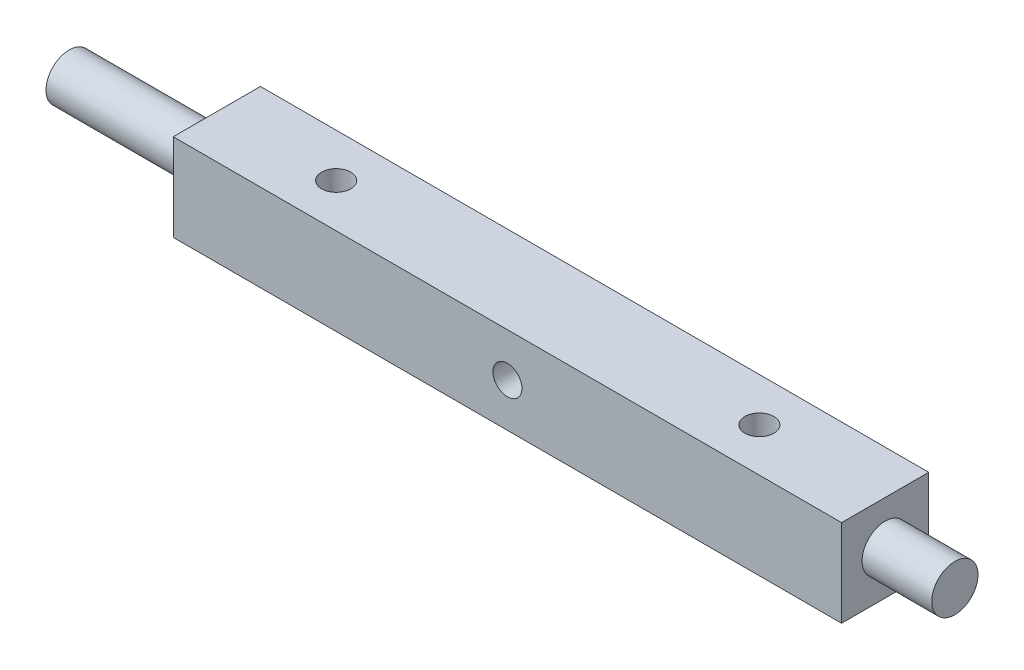
ISO-10303-21;
HEADER;
FILE_DESCRIPTION(('STEP AP214'),'2;1');
FILE_NAME('part.step','',(''),(''),'','','');
FILE_SCHEMA(('AUTOMOTIVE_DESIGN { 1 0 10303 214 1 1 1 1 }'));
ENDSEC;
DATA;
#1=APPLICATION_CONTEXT('core data for automotive mechanical design processes');
#2=APPLICATION_PROTOCOL_DEFINITION('international standard','automotive_design',2000,#1);
#3=PRODUCT_CONTEXT('',#1,'mechanical');
#4=PRODUCT('Part','Part','',(#3));
#5=PRODUCT_RELATED_PRODUCT_CATEGORY('part','',(#4));
#6=PRODUCT_DEFINITION_FORMATION('','',#4);
#7=PRODUCT_DEFINITION_CONTEXT('part definition',#1,'design');
#8=PRODUCT_DEFINITION('design','',#6,#7);
#9=PRODUCT_DEFINITION_SHAPE('','',#8);
#10=(LENGTH_UNIT() NAMED_UNIT(*) SI_UNIT(.MILLI.,.METRE.));
#11=(NAMED_UNIT(*) PLANE_ANGLE_UNIT() SI_UNIT($,.RADIAN.));
#12=(NAMED_UNIT(*) SI_UNIT($,.STERADIAN.) SOLID_ANGLE_UNIT());
#13=UNCERTAINTY_MEASURE_WITH_UNIT(LENGTH_MEASURE(1.E-05),#10,'distance_accuracy_value','');
#14=(GEOMETRIC_REPRESENTATION_CONTEXT(3) GLOBAL_UNCERTAINTY_ASSIGNED_CONTEXT((#13)) GLOBAL_UNIT_ASSIGNED_CONTEXT((#10,
#11,#12)) REPRESENTATION_CONTEXT('',''));
#15=CARTESIAN_POINT('',(0.,0.,0.));
#16=DIRECTION('',(0.,0.,1.));
#17=DIRECTION('',(1.,0.,0.));
#18=AXIS2_PLACEMENT_3D('',#15,#16,#17);
#19=CARTESIAN_POINT('',(57.5,-7.5,7.5));
#20=DIRECTION('',(0.,0.,-1.));
#21=DIRECTION('',(-1.,0.,0.));
#22=AXIS2_PLACEMENT_3D('',#19,#20,#21);
#23=PLANE('',#22);
#24=CARTESIAN_POINT('',(0.,0.,7.5));
#25=DIRECTION('',(0.,0.,1.));
#26=DIRECTION('',(1.,0.,0.));
#27=AXIS2_PLACEMENT_3D('',#24,#25,#26);
#28=CIRCLE('',#27,2.5);
#29=CARTESIAN_POINT('',(2.5,0.,7.5));
#30=VERTEX_POINT('',#29);
#31=EDGE_CURVE('E135',#30,#30,#28,.T.);
#32=ORIENTED_EDGE('',*,*,#31,.F.);
#33=EDGE_LOOP('',(#32));
#34=FACE_BOUND('',#33,.T.);
#35=DIRECTION('',(0.,-1.,0.));
#36=VECTOR('',#35,1.);
#37=CARTESIAN_POINT('',(-57.5,-7.5,7.5));
#38=LINE('',#37,#36);
#39=CARTESIAN_POINT('',(-57.5,7.5,7.5));
#40=VERTEX_POINT('',#39);
#41=CARTESIAN_POINT('',(-57.5,-7.5,7.5));
#42=VERTEX_POINT('',#41);
#43=EDGE_CURVE('E99',#40,#42,#38,.T.);
#44=ORIENTED_EDGE('',*,*,#43,.T.);
#45=DIRECTION('',(-1.,0.,0.));
#46=VECTOR('',#45,1.);
#47=CARTESIAN_POINT('',(57.5,-7.5,7.5));
#48=LINE('',#47,#46);
#49=CARTESIAN_POINT('',(57.5,-7.5,7.5));
#50=VERTEX_POINT('',#49);
#51=EDGE_CURVE('E41',#50,#42,#48,.T.);
#52=ORIENTED_EDGE('',*,*,#51,.F.);
#53=DIRECTION('',(0.,-1.,0.));
#54=VECTOR('',#53,1.);
#55=CARTESIAN_POINT('',(57.5,-7.5,7.5));
#56=LINE('',#55,#54);
#57=CARTESIAN_POINT('',(57.5,7.5,7.5));
#58=VERTEX_POINT('',#57);
#59=EDGE_CURVE('E85',#58,#50,#56,.T.);
#60=ORIENTED_EDGE('',*,*,#59,.F.);
#61=DIRECTION('',(-1.,0.,0.));
#62=VECTOR('',#61,1.);
#63=CARTESIAN_POINT('',(57.5,7.5,7.5));
#64=LINE('',#63,#62);
#65=EDGE_CURVE('E95',#58,#40,#64,.T.);
#66=ORIENTED_EDGE('',*,*,#65,.T.);
#67=EDGE_LOOP('',(#44,#52,#60,#66));
#68=FACE_BOUND('',#67,.T.);
#69=ADVANCED_FACE('F33',(#34,#68),#23,.F.);
#70=CARTESIAN_POINT('',(57.5,-7.5,-7.5));
#71=DIRECTION('',(0.,1.,0.));
#72=DIRECTION('',(0.,0.,1.));
#73=AXIS2_PLACEMENT_3D('',#70,#71,#72);
#74=PLANE('',#73);
#75=CARTESIAN_POINT('',(35.8563178898263,-7.5,0.));
#76=DIRECTION('',(0.,1.,0.));
#77=DIRECTION('',(0.,0.,1.));
#78=AXIS2_PLACEMENT_3D('',#75,#76,#77);
#79=CIRCLE('',#78,2.5);
#80=CARTESIAN_POINT('',(35.8563178898263,-7.5,2.5));
#81=VERTEX_POINT('',#80);
#82=EDGE_CURVE('E146',#81,#81,#79,.T.);
#83=ORIENTED_EDGE('',*,*,#82,.T.);
#84=EDGE_LOOP('',(#83));
#85=FACE_BOUND('',#84,.T.);
#86=CARTESIAN_POINT('',(-36.9743322561015,-7.5,0.));
#87=DIRECTION('',(0.,1.,0.));
#88=DIRECTION('',(0.,0.,1.));
#89=AXIS2_PLACEMENT_3D('',#86,#87,#88);
#90=CIRCLE('',#89,2.5);
#91=CARTESIAN_POINT('',(-36.9743322561015,-7.5,2.5));
#92=VERTEX_POINT('',#91);
#93=EDGE_CURVE('E137',#92,#92,#90,.T.);
#94=ORIENTED_EDGE('',*,*,#93,.T.);
#95=EDGE_LOOP('',(#94));
#96=FACE_BOUND('',#95,.T.);
#97=DIRECTION('',(0.,0.,-1.));
#98=VECTOR('',#97,1.);
#99=CARTESIAN_POINT('',(-57.5,-7.5,-7.5));
#100=LINE('',#99,#98);
#101=CARTESIAN_POINT('',(-57.5,-7.5,-7.5));
#102=VERTEX_POINT('',#101);
#103=EDGE_CURVE('E90',#42,#102,#100,.T.);
#104=ORIENTED_EDGE('',*,*,#103,.T.);
#105=DIRECTION('',(-1.,0.,0.));
#106=VECTOR('',#105,1.);
#107=CARTESIAN_POINT('',(57.5,-7.5,-7.5));
#108=LINE('',#107,#106);
#109=CARTESIAN_POINT('',(57.5,-7.5,-7.5));
#110=VERTEX_POINT('',#109);
#111=EDGE_CURVE('E88',#110,#102,#108,.T.);
#112=ORIENTED_EDGE('',*,*,#111,.F.);
#113=DIRECTION('',(0.,0.,-1.));
#114=VECTOR('',#113,1.);
#115=CARTESIAN_POINT('',(57.5,-7.5,-7.5));
#116=LINE('',#115,#114);
#117=EDGE_CURVE('E80',#50,#110,#116,.T.);
#118=ORIENTED_EDGE('',*,*,#117,.F.);
#119=ORIENTED_EDGE('',*,*,#51,.T.);
#120=EDGE_LOOP('',(#104,#112,#118,#119));
#121=FACE_BOUND('',#120,.T.);
#122=ADVANCED_FACE('F89',(#85,#96,#121),#74,.F.);
#123=CARTESIAN_POINT('',(57.5,-7.5,-7.5));
#124=DIRECTION('',(0.,0.,1.));
#125=DIRECTION('',(1.,0.,0.));
#126=AXIS2_PLACEMENT_3D('',#123,#124,#125);
#127=PLANE('',#126);
#128=CARTESIAN_POINT('',(0.,0.,-7.5));
#129=DIRECTION('',(0.,0.,1.));
#130=DIRECTION('',(1.,0.,0.));
#131=AXIS2_PLACEMENT_3D('',#128,#129,#130);
#132=CIRCLE('',#131,2.5);
#133=CARTESIAN_POINT('',(2.5,0.,-7.5));
#134=VERTEX_POINT('',#133);
#135=EDGE_CURVE('E102',#134,#134,#132,.T.);
#136=ORIENTED_EDGE('',*,*,#135,.T.);
#137=EDGE_LOOP('',(#136));
#138=FACE_BOUND('',#137,.T.);
#139=DIRECTION('',(0.,1.,0.));
#140=VECTOR('',#139,1.);
#141=CARTESIAN_POINT('',(-57.5,-7.5,-7.5));
#142=LINE('',#141,#140);
#143=CARTESIAN_POINT('',(-57.5,7.5,-7.5));
#144=VERTEX_POINT('',#143);
#145=EDGE_CURVE('E66',#102,#144,#142,.T.);
#146=ORIENTED_EDGE('',*,*,#145,.T.);
#147=DIRECTION('',(-1.,0.,0.));
#148=VECTOR('',#147,1.);
#149=CARTESIAN_POINT('',(57.5,7.5,-7.5));
#150=LINE('',#149,#148);
#151=CARTESIAN_POINT('',(57.5,7.5,-7.5));
#152=VERTEX_POINT('',#151);
#153=EDGE_CURVE('E91',#152,#144,#150,.T.);
#154=ORIENTED_EDGE('',*,*,#153,.F.);
#155=DIRECTION('',(0.,1.,0.));
#156=VECTOR('',#155,1.);
#157=CARTESIAN_POINT('',(57.5,-7.5,-7.5));
#158=LINE('',#157,#156);
#159=EDGE_CURVE('E83',#110,#152,#158,.T.);
#160=ORIENTED_EDGE('',*,*,#159,.F.);
#161=ORIENTED_EDGE('',*,*,#111,.T.);
#162=EDGE_LOOP('',(#146,#154,#160,#161));
#163=FACE_BOUND('',#162,.T.);
#164=ADVANCED_FACE('F93',(#138,#163),#127,.F.);
#165=CARTESIAN_POINT('',(57.5,7.5,-7.5));
#166=DIRECTION('',(0.,-1.,0.));
#167=DIRECTION('',(0.,0.,-1.));
#168=AXIS2_PLACEMENT_3D('',#165,#166,#167);
#169=PLANE('',#168);
#170=CARTESIAN_POINT('',(35.8563178898263,7.5,0.));
#171=DIRECTION('',(0.,1.,0.));
#172=DIRECTION('',(0.,0.,1.));
#173=AXIS2_PLACEMENT_3D('',#170,#171,#172);
#174=CIRCLE('',#173,2.5);
#175=CARTESIAN_POINT('',(35.8563178898263,7.5,2.5));
#176=VERTEX_POINT('',#175);
#177=EDGE_CURVE('E148',#176,#176,#174,.T.);
#178=ORIENTED_EDGE('',*,*,#177,.F.);
#179=EDGE_LOOP('',(#178));
#180=FACE_BOUND('',#179,.T.);
#181=CARTESIAN_POINT('',(-36.9743322561015,7.5,0.));
#182=DIRECTION('',(0.,1.,0.));
#183=DIRECTION('',(0.,0.,1.));
#184=AXIS2_PLACEMENT_3D('',#181,#182,#183);
#185=CIRCLE('',#184,2.5);
#186=CARTESIAN_POINT('',(-36.9743322561015,7.5,2.5));
#187=VERTEX_POINT('',#186);
#188=EDGE_CURVE('E142',#187,#187,#185,.T.);
#189=ORIENTED_EDGE('',*,*,#188,.F.);
#190=EDGE_LOOP('',(#189));
#191=FACE_BOUND('',#190,.T.);
#192=DIRECTION('',(0.,0.,1.));
#193=VECTOR('',#192,1.);
#194=CARTESIAN_POINT('',(-57.5,7.5,-7.5));
#195=LINE('',#194,#193);
#196=EDGE_CURVE('E72',#144,#40,#195,.T.);
#197=ORIENTED_EDGE('',*,*,#196,.T.);
#198=ORIENTED_EDGE('',*,*,#65,.F.);
#199=DIRECTION('',(0.,0.,1.));
#200=VECTOR('',#199,1.);
#201=CARTESIAN_POINT('',(57.5,7.5,-7.5));
#202=LINE('',#201,#200);
#203=EDGE_CURVE('E49',#152,#58,#202,.T.);
#204=ORIENTED_EDGE('',*,*,#203,.F.);
#205=ORIENTED_EDGE('',*,*,#153,.T.);
#206=EDGE_LOOP('',(#197,#198,#204,#205));
#207=FACE_BOUND('',#206,.T.);
#208=ADVANCED_FACE('F122',(#180,#191,#207),#169,.F.);
#209=CARTESIAN_POINT('',(57.5,0.,0.));
#210=DIRECTION('',(1.,0.,0.));
#211=DIRECTION('',(0.,0.,-1.));
#212=AXIS2_PLACEMENT_3D('',#209,#210,#211);
#213=PLANE('',#212);
#214=CARTESIAN_POINT('',(57.5,0.,0.));
#215=DIRECTION('',(1.,0.,0.));
#216=DIRECTION('',(0.,0.,-1.));
#217=AXIS2_PLACEMENT_3D('',#214,#215,#216);
#218=CIRCLE('',#217,3.97656918366477);
#219=CARTESIAN_POINT('',(57.5,0.,-3.97656918366477));
#220=VERTEX_POINT('',#219);
#221=EDGE_CURVE('E157',#220,#220,#218,.T.);
#222=ORIENTED_EDGE('',*,*,#221,.F.);
#223=EDGE_LOOP('',(#222));
#224=FACE_BOUND('',#223,.T.);
#225=ORIENTED_EDGE('',*,*,#59,.T.);
#226=ORIENTED_EDGE('',*,*,#117,.T.);
#227=ORIENTED_EDGE('',*,*,#159,.T.);
#228=ORIENTED_EDGE('',*,*,#203,.T.);
#229=EDGE_LOOP('',(#225,#226,#227,#228));
#230=FACE_BOUND('',#229,.T.);
#231=ADVANCED_FACE('F81',(#224,#230),#213,.T.);
#232=CARTESIAN_POINT('',(-57.5,0.,0.));
#233=DIRECTION('',(1.,0.,0.));
#234=DIRECTION('',(0.,0.,-1.));
#235=AXIS2_PLACEMENT_3D('',#232,#233,#234);
#236=PLANE('',#235);
#237=CARTESIAN_POINT('',(-57.5,0.,0.));
#238=DIRECTION('',(1.,0.,0.));
#239=DIRECTION('',(0.,0.,-1.));
#240=AXIS2_PLACEMENT_3D('',#237,#238,#239);
#241=CIRCLE('',#240,4.);
#242=CARTESIAN_POINT('',(-57.5,0.,-4.));
#243=VERTEX_POINT('',#242);
#244=EDGE_CURVE('E11',#243,#243,#241,.F.);
#245=ORIENTED_EDGE('',*,*,#244,.F.);
#246=EDGE_LOOP('',(#245));
#247=FACE_BOUND('',#246,.T.);
#248=ORIENTED_EDGE('',*,*,#43,.F.);
#249=ORIENTED_EDGE('',*,*,#196,.F.);
#250=ORIENTED_EDGE('',*,*,#145,.F.);
#251=ORIENTED_EDGE('',*,*,#103,.F.);
#252=EDGE_LOOP('',(#248,#249,#250,#251));
#253=FACE_BOUND('',#252,.T.);
#254=ADVANCED_FACE('F110',(#247,#253),#236,.F.);
#255=CARTESIAN_POINT('',(0.,0.,-7.5));
#256=DIRECTION('',(0.,0.,1.));
#257=DIRECTION('',(1.,0.,0.));
#258=AXIS2_PLACEMENT_3D('',#255,#256,#257);
#259=CYLINDRICAL_SURFACE('',#258,2.5);
#260=ORIENTED_EDGE('',*,*,#135,.F.);
#261=EDGE_LOOP('',(#260));
#262=FACE_BOUND('',#261,.T.);
#263=ORIENTED_EDGE('',*,*,#31,.T.);
#264=EDGE_LOOP('',(#263));
#265=FACE_BOUND('',#264,.T.);
#266=ADVANCED_FACE('F112',(#262,#265),#259,.F.);
#267=CARTESIAN_POINT('',(-36.9743322561015,-7.5,0.));
#268=DIRECTION('',(0.,1.,0.));
#269=DIRECTION('',(0.,0.,1.));
#270=AXIS2_PLACEMENT_3D('',#267,#268,#269);
#271=CYLINDRICAL_SURFACE('',#270,2.5);
#272=CARTESIAN_POINT('',(-36.9743322561015,-7.5,2.5));
#273=CARTESIAN_POINT('',(-36.9743322561015,-7.34375,2.5));
#274=CARTESIAN_POINT('',(-36.9743322561015,-7.1875,2.5));
#275=CARTESIAN_POINT('',(-36.9743322561015,-6.875,2.5));
#276=CARTESIAN_POINT('',(-36.9743322561015,-6.71875,2.5));
#277=CARTESIAN_POINT('',(-36.9743322561015,-6.40625,2.5));
#278=CARTESIAN_POINT('',(-36.9743322561015,-6.25,2.5));
#279=CARTESIAN_POINT('',(-36.9743322561015,-5.9375,2.5));
#280=CARTESIAN_POINT('',(-36.9743322561015,-5.78125,2.5));
#281=CARTESIAN_POINT('',(-36.9743322561015,-5.46875,2.5));
#282=CARTESIAN_POINT('',(-36.9743322561015,-5.3125,2.5));
#283=CARTESIAN_POINT('',(-36.9743322561015,-5.,2.5));
#284=CARTESIAN_POINT('',(-36.9743322561015,-4.84375,2.5));
#285=CARTESIAN_POINT('',(-36.9743322561015,-4.53125,2.5));
#286=CARTESIAN_POINT('',(-36.9743322561015,-4.375,2.5));
#287=CARTESIAN_POINT('',(-36.9743322561015,-4.0625,2.5));
#288=CARTESIAN_POINT('',(-36.9743322561015,-3.90625,2.5));
#289=CARTESIAN_POINT('',(-36.9743322561015,-3.59375,2.5));
#290=CARTESIAN_POINT('',(-36.9743322561015,-3.4375,2.5));
#291=CARTESIAN_POINT('',(-36.9743322561015,-3.125,2.5));
#292=CARTESIAN_POINT('',(-36.9743322561015,-2.96875,2.5));
#293=CARTESIAN_POINT('',(-36.9743322561015,-2.65625,2.5));
#294=CARTESIAN_POINT('',(-36.9743322561015,-2.5,2.5));
#295=CARTESIAN_POINT('',(-36.9743322561015,-2.1875,2.5));
#296=CARTESIAN_POINT('',(-36.9743322561015,-2.03125,2.5));
#297=CARTESIAN_POINT('',(-36.9743322561015,-1.71875,2.5));
#298=CARTESIAN_POINT('',(-36.9743322561015,-1.5625,2.5));
#299=CARTESIAN_POINT('',(-36.9743322561015,-1.25,2.5));
#300=CARTESIAN_POINT('',(-36.9743322561015,-1.09375,2.5));
#301=CARTESIAN_POINT('',(-36.9743322561015,-0.781250000000001,2.5));
#302=CARTESIAN_POINT('',(-36.9743322561015,-0.625000000000001,2.5));
#303=CARTESIAN_POINT('',(-36.9743322561015,-0.312500000000001,2.5));
#304=CARTESIAN_POINT('',(-36.9743322561015,-0.156250000000001,2.5));
#305=CARTESIAN_POINT('',(-36.9743322561015,0.156249999999999,2.5));
#306=CARTESIAN_POINT('',(-36.9743322561015,0.312499999999999,2.5));
#307=CARTESIAN_POINT('',(-36.9743322561015,0.624999999999999,2.5));
#308=CARTESIAN_POINT('',(-36.9743322561015,0.781249999999999,2.5));
#309=CARTESIAN_POINT('',(-36.9743322561015,1.09375,2.5));
#310=CARTESIAN_POINT('',(-36.9743322561015,1.25,2.5));
#311=CARTESIAN_POINT('',(-36.9743322561015,1.5625,2.5));
#312=CARTESIAN_POINT('',(-36.9743322561015,1.71875,2.5));
#313=CARTESIAN_POINT('',(-36.9743322561015,2.03125,2.5));
#314=CARTESIAN_POINT('',(-36.9743322561015,2.1875,2.5));
#315=CARTESIAN_POINT('',(-36.9743322561015,2.5,2.5));
#316=CARTESIAN_POINT('',(-36.9743322561015,2.65625,2.5));
#317=CARTESIAN_POINT('',(-36.9743322561015,2.96875,2.5));
#318=CARTESIAN_POINT('',(-36.9743322561015,3.125,2.5));
#319=CARTESIAN_POINT('',(-36.9743322561015,3.4375,2.5));
#320=CARTESIAN_POINT('',(-36.9743322561015,3.59375,2.5));
#321=CARTESIAN_POINT('',(-36.9743322561015,3.90625,2.5));
#322=CARTESIAN_POINT('',(-36.9743322561015,4.0625,2.5));
#323=CARTESIAN_POINT('',(-36.9743322561015,4.375,2.5));
#324=CARTESIAN_POINT('',(-36.9743322561015,4.53125,2.5));
#325=CARTESIAN_POINT('',(-36.9743322561015,4.84375,2.5));
#326=CARTESIAN_POINT('',(-36.9743322561015,5.,2.5));
#327=CARTESIAN_POINT('',(-36.9743322561015,5.3125,2.5));
#328=CARTESIAN_POINT('',(-36.9743322561015,5.46875,2.5));
#329=CARTESIAN_POINT('',(-36.9743322561015,5.78125,2.5));
#330=CARTESIAN_POINT('',(-36.9743322561015,5.9375,2.5));
#331=CARTESIAN_POINT('',(-36.9743322561015,6.25,2.5));
#332=CARTESIAN_POINT('',(-36.9743322561015,6.40625,2.5));
#333=CARTESIAN_POINT('',(-36.9743322561015,6.71875,2.5));
#334=CARTESIAN_POINT('',(-36.9743322561015,6.875,2.5));
#335=CARTESIAN_POINT('',(-36.9743322561015,7.1875,2.5));
#336=CARTESIAN_POINT('',(-36.9743322561015,7.34375,2.5));
#337=CARTESIAN_POINT('',(-36.9743322561015,7.5,2.5));
#338=B_SPLINE_CURVE_WITH_KNOTS('',3,(#272,#273,#274,#275,#276,#277,#278,#279,#280,#281,#282,
#283,#284,#285,#286,#287,#288,#289,#290,#291,#292,#293,#294,#295,#296,#297,#298,#299,#300,#301,
#302,#303,#304,#305,#306,#307,#308,#309,#310,#311,#312,#313,#314,#315,#316,#317,#318,#319,#320,
#321,#322,#323,#324,#325,#326,#327,#328,#329,#330,#331,#332,#333,#334,#335,#336,#337),
.UNSPECIFIED.,.F.,.F.,(4,2,2,2,2,2,2,2,2,2,2,2,2,2,2,2,2,2,2,2,2,2,2,2,2,2,2,2,2,2,2,2,4),(0.,
0.46875,0.937500000000001,1.40625,1.875,2.34375,2.8125,3.28125,3.75,4.21875,4.6875,5.15625,
5.625,6.09375,6.5625,7.03125,7.5,7.96875,8.4375,8.90625,9.375,9.84375,10.3125,10.78125,11.25,
11.71875,12.1875,12.65625,13.125,13.59375,14.0625,14.53125,15.),.UNSPECIFIED.);
#339=EDGE_CURVE('BSEAM119',#92,#187,#338,.T.);
#340=ORIENTED_EDGE('',*,*,#93,.F.);
#341=ORIENTED_EDGE('',*,*,#188,.T.);
#342=ORIENTED_EDGE('',*,*,#339,.T.);
#343=ORIENTED_EDGE('',*,*,#339,.F.);
#344=EDGE_LOOP('',(#340,#342,#341,#343));
#345=FACE_BOUND('',#344,.T.);
#346=ADVANCED_FACE('F119',(#345),#271,.F.);
#347=CARTESIAN_POINT('',(35.8563178898263,-7.5,0.));
#348=DIRECTION('',(0.,1.,0.));
#349=DIRECTION('',(0.,0.,1.));
#350=AXIS2_PLACEMENT_3D('',#347,#348,#349);
#351=CYLINDRICAL_SURFACE('',#350,2.5);
#352=CARTESIAN_POINT('',(35.8563178898263,-7.5,2.5));
#353=CARTESIAN_POINT('',(35.8563178898263,-7.34375,2.5));
#354=CARTESIAN_POINT('',(35.8563178898263,-7.1875,2.5));
#355=CARTESIAN_POINT('',(35.8563178898263,-6.875,2.5));
#356=CARTESIAN_POINT('',(35.8563178898263,-6.71875,2.5));
#357=CARTESIAN_POINT('',(35.8563178898263,-6.40625,2.5));
#358=CARTESIAN_POINT('',(35.8563178898263,-6.25,2.5));
#359=CARTESIAN_POINT('',(35.8563178898263,-5.9375,2.5));
#360=CARTESIAN_POINT('',(35.8563178898263,-5.78125,2.5));
#361=CARTESIAN_POINT('',(35.8563178898263,-5.46875,2.5));
#362=CARTESIAN_POINT('',(35.8563178898263,-5.3125,2.5));
#363=CARTESIAN_POINT('',(35.8563178898263,-5.,2.5));
#364=CARTESIAN_POINT('',(35.8563178898263,-4.84375,2.5));
#365=CARTESIAN_POINT('',(35.8563178898263,-4.53125,2.5));
#366=CARTESIAN_POINT('',(35.8563178898263,-4.375,2.5));
#367=CARTESIAN_POINT('',(35.8563178898263,-4.0625,2.5));
#368=CARTESIAN_POINT('',(35.8563178898263,-3.90625,2.5));
#369=CARTESIAN_POINT('',(35.8563178898263,-3.59375,2.5));
#370=CARTESIAN_POINT('',(35.8563178898263,-3.4375,2.5));
#371=CARTESIAN_POINT('',(35.8563178898263,-3.125,2.5));
#372=CARTESIAN_POINT('',(35.8563178898263,-2.96875,2.5));
#373=CARTESIAN_POINT('',(35.8563178898263,-2.65625,2.5));
#374=CARTESIAN_POINT('',(35.8563178898263,-2.5,2.5));
#375=CARTESIAN_POINT('',(35.8563178898263,-2.1875,2.5));
#376=CARTESIAN_POINT('',(35.8563178898263,-2.03125,2.5));
#377=CARTESIAN_POINT('',(35.8563178898263,-1.71875,2.5));
#378=CARTESIAN_POINT('',(35.8563178898263,-1.5625,2.5));
#379=CARTESIAN_POINT('',(35.8563178898263,-1.25,2.5));
#380=CARTESIAN_POINT('',(35.8563178898263,-1.09375,2.5));
#381=CARTESIAN_POINT('',(35.8563178898263,-0.781250000000001,2.5));
#382=CARTESIAN_POINT('',(35.8563178898263,-0.625000000000001,2.5));
#383=CARTESIAN_POINT('',(35.8563178898263,-0.312500000000001,2.5));
#384=CARTESIAN_POINT('',(35.8563178898263,-0.156250000000001,2.5));
#385=CARTESIAN_POINT('',(35.8563178898263,0.156249999999999,2.5));
#386=CARTESIAN_POINT('',(35.8563178898263,0.312499999999999,2.5));
#387=CARTESIAN_POINT('',(35.8563178898263,0.624999999999999,2.5));
#388=CARTESIAN_POINT('',(35.8563178898263,0.781249999999999,2.5));
#389=CARTESIAN_POINT('',(35.8563178898263,1.09375,2.5));
#390=CARTESIAN_POINT('',(35.8563178898263,1.25,2.5));
#391=CARTESIAN_POINT('',(35.8563178898263,1.5625,2.5));
#392=CARTESIAN_POINT('',(35.8563178898263,1.71875,2.5));
#393=CARTESIAN_POINT('',(35.8563178898263,2.03125,2.5));
#394=CARTESIAN_POINT('',(35.8563178898263,2.1875,2.5));
#395=CARTESIAN_POINT('',(35.8563178898263,2.5,2.5));
#396=CARTESIAN_POINT('',(35.8563178898263,2.65625,2.5));
#397=CARTESIAN_POINT('',(35.8563178898263,2.96875,2.5));
#398=CARTESIAN_POINT('',(35.8563178898263,3.125,2.5));
#399=CARTESIAN_POINT('',(35.8563178898263,3.4375,2.5));
#400=CARTESIAN_POINT('',(35.8563178898263,3.59375,2.5));
#401=CARTESIAN_POINT('',(35.8563178898263,3.90625,2.5));
#402=CARTESIAN_POINT('',(35.8563178898263,4.0625,2.5));
#403=CARTESIAN_POINT('',(35.8563178898263,4.375,2.5));
#404=CARTESIAN_POINT('',(35.8563178898263,4.53125,2.5));
#405=CARTESIAN_POINT('',(35.8563178898263,4.84375,2.5));
#406=CARTESIAN_POINT('',(35.8563178898263,5.,2.5));
#407=CARTESIAN_POINT('',(35.8563178898263,5.3125,2.5));
#408=CARTESIAN_POINT('',(35.8563178898263,5.46875,2.5));
#409=CARTESIAN_POINT('',(35.8563178898263,5.78125,2.5));
#410=CARTESIAN_POINT('',(35.8563178898263,5.9375,2.5));
#411=CARTESIAN_POINT('',(35.8563178898263,6.25,2.5));
#412=CARTESIAN_POINT('',(35.8563178898263,6.40625,2.5));
#413=CARTESIAN_POINT('',(35.8563178898263,6.71875,2.5));
#414=CARTESIAN_POINT('',(35.8563178898263,6.875,2.5));
#415=CARTESIAN_POINT('',(35.8563178898263,7.1875,2.5));
#416=CARTESIAN_POINT('',(35.8563178898263,7.34375,2.5));
#417=CARTESIAN_POINT('',(35.8563178898263,7.5,2.5));
#418=B_SPLINE_CURVE_WITH_KNOTS('',3,(#352,#353,#354,#355,#356,#357,#358,#359,#360,#361,#362,
#363,#364,#365,#366,#367,#368,#369,#370,#371,#372,#373,#374,#375,#376,#377,#378,#379,#380,#381,
#382,#383,#384,#385,#386,#387,#388,#389,#390,#391,#392,#393,#394,#395,#396,#397,#398,#399,#400,
#401,#402,#403,#404,#405,#406,#407,#408,#409,#410,#411,#412,#413,#414,#415,#416,#417),
.UNSPECIFIED.,.F.,.F.,(4,2,2,2,2,2,2,2,2,2,2,2,2,2,2,2,2,2,2,2,2,2,2,2,2,2,2,2,2,2,2,2,4),(0.,
0.46875,0.937500000000001,1.40625,1.875,2.34375,2.8125,3.28125,3.75,4.21875,4.6875,5.15625,
5.625,6.09375,6.5625,7.03125,7.5,7.96875,8.4375,8.90625,9.375,9.84375,10.3125,10.78125,11.25,
11.71875,12.1875,12.65625,13.125,13.59375,14.0625,14.53125,15.),.UNSPECIFIED.);
#419=EDGE_CURVE('BSEAM182',#81,#176,#418,.T.);
#420=ORIENTED_EDGE('',*,*,#82,.F.);
#421=ORIENTED_EDGE('',*,*,#177,.T.);
#422=ORIENTED_EDGE('',*,*,#419,.T.);
#423=ORIENTED_EDGE('',*,*,#419,.F.);
#424=EDGE_LOOP('',(#420,#422,#421,#423));
#425=FACE_BOUND('',#424,.T.);
#426=ADVANCED_FACE('F182',(#425),#351,.F.);
#427=CARTESIAN_POINT('',(-82.9,0.,0.));
#428=DIRECTION('',(1.,0.,0.));
#429=DIRECTION('',(0.,0.,-1.));
#430=AXIS2_PLACEMENT_3D('',#427,#428,#429);
#431=CYLINDRICAL_SURFACE('',#430,4.);
#432=CARTESIAN_POINT('',(-82.9,0.,0.));
#433=DIRECTION('',(-1.,0.,0.));
#434=DIRECTION('',(0.,0.,1.));
#435=AXIS2_PLACEMENT_3D('',#432,#433,#434);
#436=CIRCLE('',#435,4.);
#437=CARTESIAN_POINT('',(-82.9,0.,4.));
#438=VERTEX_POINT('',#437);
#439=EDGE_CURVE('E151',#438,#438,#436,.T.);
#440=ORIENTED_EDGE('',*,*,#439,.F.);
#441=EDGE_LOOP('',(#440));
#442=FACE_BOUND('',#441,.T.);
#443=ORIENTED_EDGE('',*,*,#244,.T.);
#444=EDGE_LOOP('',(#443));
#445=FACE_BOUND('',#444,.T.);
#446=ADVANCED_FACE('F176',(#442,#445),#431,.T.);
#447=CARTESIAN_POINT('',(-82.9,0.,0.));
#448=DIRECTION('',(-1.,0.,0.));
#449=DIRECTION('',(0.,0.,1.));
#450=AXIS2_PLACEMENT_3D('',#447,#448,#449);
#451=PLANE('',#450);
#452=ORIENTED_EDGE('',*,*,#439,.T.);
#453=EDGE_LOOP('',(#452));
#454=FACE_BOUND('',#453,.T.);
#455=ADVANCED_FACE('F168',(#454),#451,.T.);
#456=CARTESIAN_POINT('',(69.5,0.,0.));
#457=DIRECTION('',(-1.,0.,0.));
#458=DIRECTION('',(0.,0.,1.));
#459=AXIS2_PLACEMENT_3D('',#456,#457,#458);
#460=CYLINDRICAL_SURFACE('',#459,3.97656918366477);
#461=CARTESIAN_POINT('',(69.5,0.,0.));
#462=DIRECTION('',(1.,0.,0.));
#463=DIRECTION('',(0.,0.,-1.));
#464=AXIS2_PLACEMENT_3D('',#461,#462,#463);
#465=CIRCLE('',#464,3.97656918366477);
#466=CARTESIAN_POINT('',(69.5,0.,-3.97656918366477));
#467=VERTEX_POINT('',#466);
#468=EDGE_CURVE('E156',#467,#467,#465,.T.);
#469=ORIENTED_EDGE('',*,*,#468,.F.);
#470=EDGE_LOOP('',(#469));
#471=FACE_BOUND('',#470,.T.);
#472=ORIENTED_EDGE('',*,*,#221,.T.);
#473=EDGE_LOOP('',(#472));
#474=FACE_BOUND('',#473,.T.);
#475=ADVANCED_FACE('F165',(#471,#474),#460,.T.);
#476=CARTESIAN_POINT('',(69.5,0.,0.));
#477=DIRECTION('',(1.,0.,0.));
#478=DIRECTION('',(0.,0.,-1.));
#479=AXIS2_PLACEMENT_3D('',#476,#477,#478);
#480=PLANE('',#479);
#481=ORIENTED_EDGE('',*,*,#468,.T.);
#482=EDGE_LOOP('',(#481));
#483=FACE_BOUND('',#482,.T.);
#484=ADVANCED_FACE('F163',(#483),#480,.T.);
#485=CLOSED_SHELL('',(#69,#122,#164,#208,#231,#254,#266,#346,#426,#446,#455,#475,#484));
#486=MANIFOLD_SOLID_BREP('B2',#485);
#487=ADVANCED_BREP_SHAPE_REPRESENTATION('',(#18,#486),#14);
#488=SHAPE_DEFINITION_REPRESENTATION(#9,#487);
ENDSEC;
END-ISO-10303-21;
